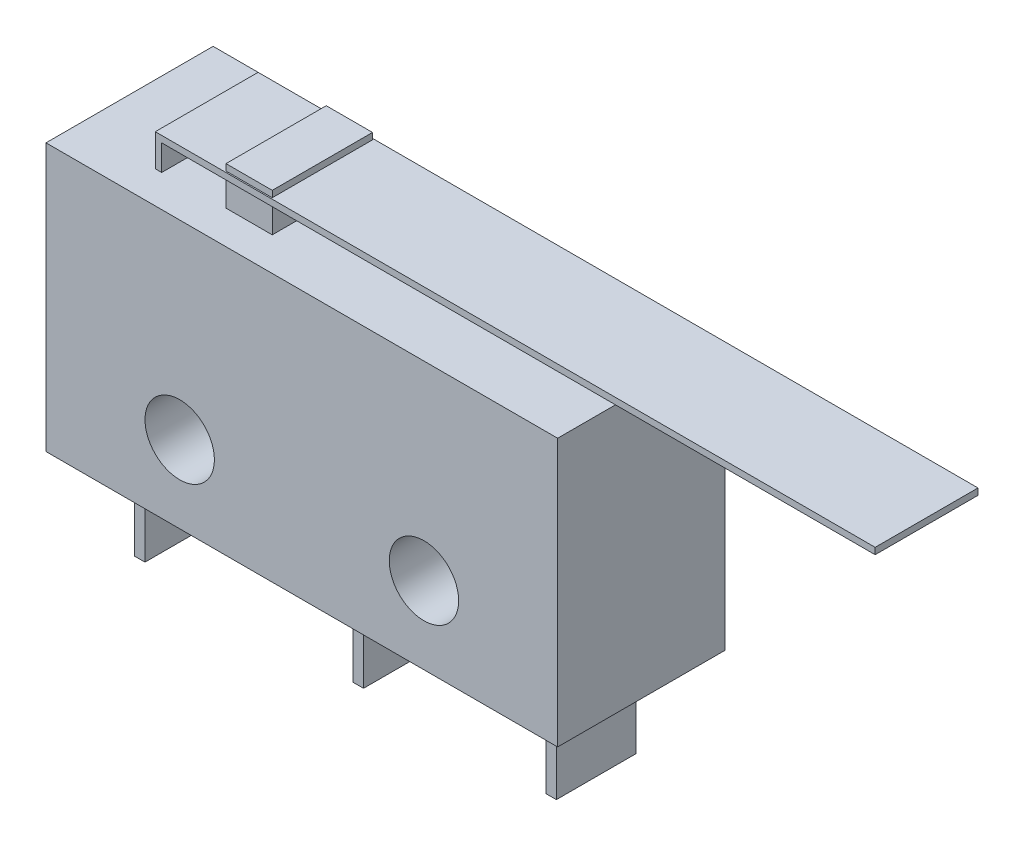
ISO-10303-21;
HEADER;
FILE_DESCRIPTION(('STEP AP214'),'2;1');
FILE_NAME('part.step','',(''),(''),'','','');
FILE_SCHEMA(('AUTOMOTIVE_DESIGN { 1 0 10303 214 1 1 1 1 }'));
ENDSEC;
DATA;
#1=APPLICATION_CONTEXT('core data for automotive mechanical design processes');
#2=APPLICATION_PROTOCOL_DEFINITION('international standard','automotive_design',2000,#1);
#3=PRODUCT_CONTEXT('',#1,'mechanical');
#4=PRODUCT('Part','Part','',(#3));
#5=PRODUCT_RELATED_PRODUCT_CATEGORY('part','',(#4));
#6=PRODUCT_DEFINITION_FORMATION('','',#4);
#7=PRODUCT_DEFINITION_CONTEXT('part definition',#1,'design');
#8=PRODUCT_DEFINITION('design','',#6,#7);
#9=PRODUCT_DEFINITION_SHAPE('','',#8);
#10=(LENGTH_UNIT() NAMED_UNIT(*) SI_UNIT(.MILLI.,.METRE.));
#11=(NAMED_UNIT(*) PLANE_ANGLE_UNIT() SI_UNIT($,.RADIAN.));
#12=(NAMED_UNIT(*) SI_UNIT($,.STERADIAN.) SOLID_ANGLE_UNIT());
#13=UNCERTAINTY_MEASURE_WITH_UNIT(LENGTH_MEASURE(1.E-05),#10,'distance_accuracy_value','');
#14=(GEOMETRIC_REPRESENTATION_CONTEXT(3) GLOBAL_UNCERTAINTY_ASSIGNED_CONTEXT((#13)) GLOBAL_UNIT_ASSIGNED_CONTEXT((#10,
#11,#12)) REPRESENTATION_CONTEXT('',''));
#15=CARTESIAN_POINT('',(0.,0.,0.));
#16=DIRECTION('',(0.,0.,1.));
#17=DIRECTION('',(1.,0.,0.));
#18=AXIS2_PLACEMENT_3D('',#15,#16,#17);
#19=CARTESIAN_POINT('',(-2.45,6.7,-1.95));
#20=DIRECTION('',(-1.,0.,0.));
#21=DIRECTION('',(0.,0.,1.));
#22=AXIS2_PLACEMENT_3D('',#19,#20,#21);
#23=PLANE('',#22);
#24=DIRECTION('',(0.,0.,-1.));
#25=VECTOR('',#24,1.);
#26=CARTESIAN_POINT('',(-2.45,6.2,-1.95));
#27=LINE('',#26,#25);
#28=CARTESIAN_POINT('',(-2.45,6.2,1.95));
#29=VERTEX_POINT('',#28);
#30=CARTESIAN_POINT('',(-2.45,6.2,-1.95));
#31=VERTEX_POINT('',#30);
#32=EDGE_CURVE('E295',#29,#31,#27,.T.);
#33=ORIENTED_EDGE('',*,*,#32,.F.);
#34=DIRECTION('',(0.,-1.,0.));
#35=VECTOR('',#34,1.);
#36=CARTESIAN_POINT('',(-2.45,6.7,1.95));
#37=LINE('',#36,#35);
#38=CARTESIAN_POINT('',(-2.45,5.2,1.95));
#39=VERTEX_POINT('',#38);
#40=EDGE_CURVE('E309',#29,#39,#37,.T.);
#41=ORIENTED_EDGE('',*,*,#40,.T.);
#42=DIRECTION('',(0.,0.,-1.));
#43=VECTOR('',#42,1.);
#44=CARTESIAN_POINT('',(-2.45,5.2,-1.95));
#45=LINE('',#44,#43);
#46=CARTESIAN_POINT('',(-2.45,5.2,-1.95));
#47=VERTEX_POINT('',#46);
#48=EDGE_CURVE('E298',#39,#47,#45,.T.);
#49=ORIENTED_EDGE('',*,*,#48,.T.);
#50=DIRECTION('',(0.,-1.,0.));
#51=VECTOR('',#50,1.);
#52=CARTESIAN_POINT('',(-2.45,6.7,-1.95));
#53=LINE('',#52,#51);
#54=EDGE_CURVE('E330',#31,#47,#53,.T.);
#55=ORIENTED_EDGE('',*,*,#54,.F.);
#56=EDGE_LOOP('',(#33,#41,#49,#55));
#57=FACE_BOUND('',#56,.T.);
#58=ADVANCED_FACE('F34',(#57),#23,.F.);
#59=CARTESIAN_POINT('',(-2.45,6.7,-1.95));
#60=DIRECTION('',(0.,0.,1.));
#61=DIRECTION('',(1.,0.,0.));
#62=AXIS2_PLACEMENT_3D('',#59,#60,#61);
#63=PLANE('',#62);
#64=DIRECTION('',(-1.,0.,0.));
#65=VECTOR('',#64,1.);
#66=CARTESIAN_POINT('',(-2.45,6.2,-1.95));
#67=LINE('',#66,#65);
#68=CARTESIAN_POINT('',(-4.25,6.2,-1.95));
#69=VERTEX_POINT('',#68);
#70=EDGE_CURVE('E292',#31,#69,#67,.T.);
#71=ORIENTED_EDGE('',*,*,#70,.F.);
#72=ORIENTED_EDGE('',*,*,#54,.T.);
#73=DIRECTION('',(-1.,0.,0.));
#74=VECTOR('',#73,1.);
#75=CARTESIAN_POINT('',(-2.45,5.2,-1.95));
#76=LINE('',#75,#74);
#77=CARTESIAN_POINT('',(-4.25,5.2,-1.95));
#78=VERTEX_POINT('',#77);
#79=EDGE_CURVE('E312',#47,#78,#76,.T.);
#80=ORIENTED_EDGE('',*,*,#79,.T.);
#81=DIRECTION('',(0.,-1.,0.));
#82=VECTOR('',#81,1.);
#83=CARTESIAN_POINT('',(-4.25,6.7,-1.95));
#84=LINE('',#83,#82);
#85=EDGE_CURVE('E326',#69,#78,#84,.T.);
#86=ORIENTED_EDGE('',*,*,#85,.F.);
#87=EDGE_LOOP('',(#71,#72,#80,#86));
#88=FACE_BOUND('',#87,.T.);
#89=ADVANCED_FACE('F497',(#88),#63,.F.);
#90=CARTESIAN_POINT('',(-4.25,6.7,-1.95));
#91=DIRECTION('',(1.,0.,0.));
#92=DIRECTION('',(0.,0.,-1.));
#93=AXIS2_PLACEMENT_3D('',#90,#91,#92);
#94=PLANE('',#93);
#95=DIRECTION('',(0.,0.,1.));
#96=VECTOR('',#95,1.);
#97=CARTESIAN_POINT('',(-4.25,6.2,-1.95));
#98=LINE('',#97,#96);
#99=CARTESIAN_POINT('',(-4.25,6.2,1.95));
#100=VERTEX_POINT('',#99);
#101=EDGE_CURVE('E289',#69,#100,#98,.T.);
#102=ORIENTED_EDGE('',*,*,#101,.F.);
#103=ORIENTED_EDGE('',*,*,#85,.T.);
#104=DIRECTION('',(0.,0.,1.));
#105=VECTOR('',#104,1.);
#106=CARTESIAN_POINT('',(-4.25,5.2,-1.95));
#107=LINE('',#106,#105);
#108=CARTESIAN_POINT('',(-4.25,5.2,1.95));
#109=VERTEX_POINT('',#108);
#110=EDGE_CURVE('E315',#78,#109,#107,.T.);
#111=ORIENTED_EDGE('',*,*,#110,.T.);
#112=DIRECTION('',(0.,-1.,0.));
#113=VECTOR('',#112,1.);
#114=CARTESIAN_POINT('',(-4.25,6.7,1.95));
#115=LINE('',#114,#113);
#116=EDGE_CURVE('E323',#100,#109,#115,.T.);
#117=ORIENTED_EDGE('',*,*,#116,.F.);
#118=EDGE_LOOP('',(#102,#103,#111,#117));
#119=FACE_BOUND('',#118,.T.);
#120=ADVANCED_FACE('F504',(#119),#94,.F.);
#121=CARTESIAN_POINT('',(-2.45,6.7,1.95));
#122=DIRECTION('',(0.,0.,-1.));
#123=DIRECTION('',(-1.,0.,0.));
#124=AXIS2_PLACEMENT_3D('',#121,#122,#123);
#125=PLANE('',#124);
#126=DIRECTION('',(1.,0.,0.));
#127=VECTOR('',#126,1.);
#128=CARTESIAN_POINT('',(-2.45,6.2,1.95));
#129=LINE('',#128,#127);
#130=EDGE_CURVE('E11',#100,#29,#129,.T.);
#131=ORIENTED_EDGE('',*,*,#130,.F.);
#132=ORIENTED_EDGE('',*,*,#116,.T.);
#133=DIRECTION('',(1.,0.,0.));
#134=VECTOR('',#133,1.);
#135=CARTESIAN_POINT('',(-2.45,5.2,1.95));
#136=LINE('',#135,#134);
#137=EDGE_CURVE('E303',#109,#39,#136,.T.);
#138=ORIENTED_EDGE('',*,*,#137,.T.);
#139=ORIENTED_EDGE('',*,*,#40,.F.);
#140=EDGE_LOOP('',(#131,#132,#138,#139));
#141=FACE_BOUND('',#140,.T.);
#142=ADVANCED_FACE('F594',(#141),#125,.F.);
#143=CARTESIAN_POINT('',(-9.95,5.2,3.25));
#144=DIRECTION('',(0.,-1.,0.));
#145=DIRECTION('',(0.,0.,-1.));
#146=AXIS2_PLACEMENT_3D('',#143,#144,#145);
#147=PLANE('',#146);
#148=DIRECTION('',(0.,0.,-1.));
#149=VECTOR('',#148,1.);
#150=CARTESIAN_POINT('',(-6.7,5.2,2.));
#151=LINE('',#150,#149);
#152=CARTESIAN_POINT('',(-6.7,5.2,2.));
#153=VERTEX_POINT('',#152);
#154=CARTESIAN_POINT('',(-6.7,5.2,-2.));
#155=VERTEX_POINT('',#154);
#156=EDGE_CURVE('E49',#153,#155,#151,.T.);
#157=ORIENTED_EDGE('',*,*,#156,.F.);
#158=DIRECTION('',(1.,0.,0.));
#159=VECTOR('',#158,1.);
#160=CARTESIAN_POINT('',(-6.95,5.2,2.));
#161=LINE('',#160,#159);
#162=CARTESIAN_POINT('',(-6.95,5.2,2.));
#163=VERTEX_POINT('',#162);
#164=EDGE_CURVE('E54',#163,#153,#161,.T.);
#165=ORIENTED_EDGE('',*,*,#164,.F.);
#166=DIRECTION('',(0.,0.,-1.));
#167=VECTOR('',#166,1.);
#168=CARTESIAN_POINT('',(-6.95,5.2,2.));
#169=LINE('',#168,#167);
#170=CARTESIAN_POINT('',(-6.95,5.2,-2.));
#171=VERTEX_POINT('',#170);
#172=EDGE_CURVE('E258',#163,#171,#169,.T.);
#173=ORIENTED_EDGE('',*,*,#172,.T.);
#174=DIRECTION('',(1.,0.,0.));
#175=VECTOR('',#174,1.);
#176=CARTESIAN_POINT('',(-6.95,5.2,-2.));
#177=LINE('',#176,#175);
#178=EDGE_CURVE('E259',#171,#155,#177,.T.);
#179=ORIENTED_EDGE('',*,*,#178,.T.);
#180=EDGE_LOOP('',(#157,#165,#173,#179));
#181=FACE_BOUND('',#180,.T.);
#182=DIRECTION('',(-1.,0.,0.));
#183=VECTOR('',#182,1.);
#184=CARTESIAN_POINT('',(-9.95,5.2,-3.25));
#185=LINE('',#184,#183);
#186=CARTESIAN_POINT('',(9.95,5.2,-3.25));
#187=VERTEX_POINT('',#186);
#188=CARTESIAN_POINT('',(-9.95,5.2,-3.25));
#189=VERTEX_POINT('',#188);
#190=EDGE_CURVE('E450',#187,#189,#185,.T.);
#191=ORIENTED_EDGE('',*,*,#190,.T.);
#192=DIRECTION('',(0.,0.,-1.));
#193=VECTOR('',#192,1.);
#194=CARTESIAN_POINT('',(-9.95,5.2,3.25));
#195=LINE('',#194,#193);
#196=CARTESIAN_POINT('',(-9.95,5.2,3.25));
#197=VERTEX_POINT('',#196);
#198=EDGE_CURVE('E456',#197,#189,#195,.T.);
#199=ORIENTED_EDGE('',*,*,#198,.F.);
#200=DIRECTION('',(-1.,0.,0.));
#201=VECTOR('',#200,1.);
#202=CARTESIAN_POINT('',(-9.95,5.2,3.25));
#203=LINE('',#202,#201);
#204=CARTESIAN_POINT('',(9.95,5.2,3.25));
#205=VERTEX_POINT('',#204);
#206=EDGE_CURVE('E454',#205,#197,#203,.T.);
#207=ORIENTED_EDGE('',*,*,#206,.F.);
#208=DIRECTION('',(0.,0.,-1.));
#209=VECTOR('',#208,1.);
#210=CARTESIAN_POINT('',(9.95,5.2,3.25));
#211=LINE('',#210,#209);
#212=EDGE_CURVE('E466',#205,#187,#211,.T.);
#213=ORIENTED_EDGE('',*,*,#212,.T.);
#214=EDGE_LOOP('',(#191,#199,#207,#213));
#215=FACE_BOUND('',#214,.T.);
#216=ORIENTED_EDGE('',*,*,#48,.F.);
#217=ORIENTED_EDGE('',*,*,#137,.F.);
#218=ORIENTED_EDGE('',*,*,#110,.F.);
#219=ORIENTED_EDGE('',*,*,#79,.F.);
#220=EDGE_LOOP('',(#216,#217,#218,#219));
#221=FACE_BOUND('',#220,.T.);
#222=ADVANCED_FACE('F590',(#181,#215,#221),#147,.F.);
#223=CARTESIAN_POINT('',(-9.95,-5.2,3.25));
#224=DIRECTION('',(0.,1.,0.));
#225=DIRECTION('',(-1.,0.,0.));
#226=AXIS2_PLACEMENT_3D('',#223,#224,#225);
#227=PLANE('',#226);
#228=DIRECTION('',(0.,0.,-1.));
#229=VECTOR('',#228,1.);
#230=CARTESIAN_POINT('',(-8.2,-5.2,1.55));
#231=LINE('',#230,#229);
#232=CARTESIAN_POINT('',(-8.2,-5.2,1.55));
#233=VERTEX_POINT('',#232);
#234=CARTESIAN_POINT('',(-8.2,-5.2,-1.55));
#235=VERTEX_POINT('',#234);
#236=EDGE_CURVE('E367',#233,#235,#231,.T.);
#237=ORIENTED_EDGE('',*,*,#236,.F.);
#238=DIRECTION('',(-1.,0.,0.));
#239=VECTOR('',#238,1.);
#240=CARTESIAN_POINT('',(-8.2,-5.2,1.55));
#241=LINE('',#240,#239);
#242=CARTESIAN_POINT('',(-7.8,-5.2,1.55));
#243=VERTEX_POINT('',#242);
#244=EDGE_CURVE('E372',#243,#233,#241,.T.);
#245=ORIENTED_EDGE('',*,*,#244,.F.);
#246=DIRECTION('',(0.,0.,1.));
#247=VECTOR('',#246,1.);
#248=CARTESIAN_POINT('',(-7.8,-5.2,1.55));
#249=LINE('',#248,#247);
#250=CARTESIAN_POINT('',(-7.8,-5.2,-1.55));
#251=VERTEX_POINT('',#250);
#252=EDGE_CURVE('E384',#251,#243,#249,.T.);
#253=ORIENTED_EDGE('',*,*,#252,.F.);
#254=DIRECTION('',(1.,0.,0.));
#255=VECTOR('',#254,1.);
#256=CARTESIAN_POINT('',(-8.2,-5.2,-1.55));
#257=LINE('',#256,#255);
#258=EDGE_CURVE('E381',#235,#251,#257,.T.);
#259=ORIENTED_EDGE('',*,*,#258,.F.);
#260=EDGE_LOOP('',(#237,#245,#253,#259));
#261=FACE_BOUND('',#260,.T.);
#262=DIRECTION('',(1.,0.,0.));
#263=VECTOR('',#262,1.);
#264=CARTESIAN_POINT('',(-9.95,-5.2,-3.25));
#265=LINE('',#264,#263);
#266=CARTESIAN_POINT('',(-9.95,-5.2,-3.25));
#267=VERTEX_POINT('',#266);
#268=CARTESIAN_POINT('',(9.95,-5.2,-3.25));
#269=VERTEX_POINT('',#268);
#270=EDGE_CURVE('E459',#267,#269,#265,.T.);
#271=ORIENTED_EDGE('',*,*,#270,.T.);
#272=DIRECTION('',(0.,0.,-1.));
#273=VECTOR('',#272,1.);
#274=CARTESIAN_POINT('',(9.95,-5.2,3.25));
#275=LINE('',#274,#273);
#276=CARTESIAN_POINT('',(9.95,-5.2,3.25));
#277=VERTEX_POINT('',#276);
#278=EDGE_CURVE('E469',#277,#269,#275,.T.);
#279=ORIENTED_EDGE('',*,*,#278,.F.);
#280=DIRECTION('',(1.,0.,0.));
#281=VECTOR('',#280,1.);
#282=CARTESIAN_POINT('',(-9.95,-5.2,3.25));
#283=LINE('',#282,#281);
#284=CARTESIAN_POINT('',(-9.95,-5.2,3.25));
#285=VERTEX_POINT('',#284);
#286=EDGE_CURVE('E449',#285,#277,#283,.T.);
#287=ORIENTED_EDGE('',*,*,#286,.F.);
#288=DIRECTION('',(0.,0.,-1.));
#289=VECTOR('',#288,1.);
#290=CARTESIAN_POINT('',(-9.95,-5.2,3.25));
#291=LINE('',#290,#289);
#292=EDGE_CURVE('E472',#285,#267,#291,.T.);
#293=ORIENTED_EDGE('',*,*,#292,.T.);
#294=EDGE_LOOP('',(#271,#279,#287,#293));
#295=FACE_BOUND('',#294,.T.);
#296=DIRECTION('',(0.,0.,-1.));
#297=VECTOR('',#296,1.);
#298=CARTESIAN_POINT('',(0.300000000000001,-5.2,1.55));
#299=LINE('',#298,#297);
#300=CARTESIAN_POINT('',(0.300000000000001,-5.2,1.55));
#301=VERTEX_POINT('',#300);
#302=CARTESIAN_POINT('',(0.3,-5.2,-1.55));
#303=VERTEX_POINT('',#302);
#304=EDGE_CURVE('E400',#301,#303,#299,.T.);
#305=ORIENTED_EDGE('',*,*,#304,.F.);
#306=DIRECTION('',(-1.,0.,0.));
#307=VECTOR('',#306,1.);
#308=CARTESIAN_POINT('',(0.300000000000001,-5.2,1.55));
#309=LINE('',#308,#307);
#310=CARTESIAN_POINT('',(0.700000000000001,-5.2,1.55));
#311=VERTEX_POINT('',#310);
#312=EDGE_CURVE('E405',#311,#301,#309,.T.);
#313=ORIENTED_EDGE('',*,*,#312,.F.);
#314=DIRECTION('',(0.,0.,1.));
#315=VECTOR('',#314,1.);
#316=CARTESIAN_POINT('',(0.700000000000001,-5.2,1.55));
#317=LINE('',#316,#315);
#318=CARTESIAN_POINT('',(0.700000000000001,-5.2,-1.55));
#319=VERTEX_POINT('',#318);
#320=EDGE_CURVE('E417',#319,#311,#317,.T.);
#321=ORIENTED_EDGE('',*,*,#320,.F.);
#322=DIRECTION('',(1.,0.,0.));
#323=VECTOR('',#322,1.);
#324=CARTESIAN_POINT('',(0.300000000000001,-5.2,-1.55));
#325=LINE('',#324,#323);
#326=EDGE_CURVE('E414',#303,#319,#325,.T.);
#327=ORIENTED_EDGE('',*,*,#326,.F.);
#328=EDGE_LOOP('',(#305,#313,#321,#327));
#329=FACE_BOUND('',#328,.T.);
#330=DIRECTION('',(0.,0.,1.));
#331=VECTOR('',#330,1.);
#332=CARTESIAN_POINT('',(8.2,-5.2,1.55));
#333=LINE('',#332,#331);
#334=CARTESIAN_POINT('',(8.2,-5.2,-1.55));
#335=VERTEX_POINT('',#334);
#336=CARTESIAN_POINT('',(8.2,-5.2,1.55));
#337=VERTEX_POINT('',#336);
#338=EDGE_CURVE('E334',#335,#337,#333,.T.);
#339=ORIENTED_EDGE('',*,*,#338,.F.);
#340=DIRECTION('',(1.,0.,0.));
#341=VECTOR('',#340,1.);
#342=CARTESIAN_POINT('',(8.2,-5.2,-1.55));
#343=LINE('',#342,#341);
#344=CARTESIAN_POINT('',(7.8,-5.2,-1.55));
#345=VERTEX_POINT('',#344);
#346=EDGE_CURVE('E339',#345,#335,#343,.T.);
#347=ORIENTED_EDGE('',*,*,#346,.F.);
#348=DIRECTION('',(0.,0.,-1.));
#349=VECTOR('',#348,1.);
#350=CARTESIAN_POINT('',(7.8,-5.2,1.55));
#351=LINE('',#350,#349);
#352=CARTESIAN_POINT('',(7.8,-5.2,1.55));
#353=VERTEX_POINT('',#352);
#354=EDGE_CURVE('E351',#353,#345,#351,.T.);
#355=ORIENTED_EDGE('',*,*,#354,.F.);
#356=DIRECTION('',(-1.,0.,0.));
#357=VECTOR('',#356,1.);
#358=CARTESIAN_POINT('',(8.2,-5.2,1.55));
#359=LINE('',#358,#357);
#360=EDGE_CURVE('E348',#337,#353,#359,.T.);
#361=ORIENTED_EDGE('',*,*,#360,.F.);
#362=EDGE_LOOP('',(#339,#347,#355,#361));
#363=FACE_BOUND('',#362,.T.);
#364=ADVANCED_FACE('F593',(#261,#295,#329,#363),#227,.F.);
#365=CARTESIAN_POINT('',(-9.95,5.2,3.25));
#366=DIRECTION('',(1.,0.,0.));
#367=DIRECTION('',(0.,0.,-1.));
#368=AXIS2_PLACEMENT_3D('',#365,#366,#367);
#369=PLANE('',#368);
#370=DIRECTION('',(0.,-1.,0.));
#371=VECTOR('',#370,1.);
#372=CARTESIAN_POINT('',(-9.95,5.2,-3.25));
#373=LINE('',#372,#371);
#374=EDGE_CURVE('E445',#189,#267,#373,.T.);
#375=ORIENTED_EDGE('',*,*,#374,.T.);
#376=ORIENTED_EDGE('',*,*,#292,.F.);
#377=DIRECTION('',(0.,-1.,0.));
#378=VECTOR('',#377,1.);
#379=CARTESIAN_POINT('',(-9.95,5.2,3.25));
#380=LINE('',#379,#378);
#381=EDGE_CURVE('E446',#197,#285,#380,.T.);
#382=ORIENTED_EDGE('',*,*,#381,.F.);
#383=ORIENTED_EDGE('',*,*,#198,.T.);
#384=EDGE_LOOP('',(#375,#376,#382,#383));
#385=FACE_BOUND('',#384,.T.);
#386=ADVANCED_FACE('F36',(#385),#369,.F.);
#387=CARTESIAN_POINT('',(9.95,5.2,3.25));
#388=DIRECTION('',(-1.,0.,0.));
#389=DIRECTION('',(0.,0.,1.));
#390=AXIS2_PLACEMENT_3D('',#387,#388,#389);
#391=PLANE('',#390);
#392=DIRECTION('',(0.,1.,0.));
#393=VECTOR('',#392,1.);
#394=CARTESIAN_POINT('',(9.95,5.2,-3.25));
#395=LINE('',#394,#393);
#396=EDGE_CURVE('E461',#269,#187,#395,.T.);
#397=ORIENTED_EDGE('',*,*,#396,.T.);
#398=ORIENTED_EDGE('',*,*,#212,.F.);
#399=DIRECTION('',(0.,1.,0.));
#400=VECTOR('',#399,1.);
#401=CARTESIAN_POINT('',(9.95,5.2,3.25));
#402=LINE('',#401,#400);
#403=EDGE_CURVE('E452',#277,#205,#402,.T.);
#404=ORIENTED_EDGE('',*,*,#403,.F.);
#405=ORIENTED_EDGE('',*,*,#278,.T.);
#406=EDGE_LOOP('',(#397,#398,#404,#405));
#407=FACE_BOUND('',#406,.T.);
#408=ADVANCED_FACE('F585',(#407),#391,.F.);
#409=CARTESIAN_POINT('',(0.,0.,3.25));
#410=DIRECTION('',(0.,0.,1.));
#411=DIRECTION('',(1.,0.,0.));
#412=AXIS2_PLACEMENT_3D('',#409,#410,#411);
#413=PLANE('',#412);
#414=CARTESIAN_POINT('',(-4.75,-2.2,3.25));
#415=DIRECTION('',(0.,0.,1.));
#416=DIRECTION('',(1.,0.,0.));
#417=AXIS2_PLACEMENT_3D('',#414,#415,#416);
#418=CIRCLE('',#417,1.35);
#419=CARTESIAN_POINT('',(-3.4,-2.2,3.25));
#420=VERTEX_POINT('',#419);
#421=EDGE_CURVE('E433',#420,#420,#418,.T.);
#422=ORIENTED_EDGE('',*,*,#421,.F.);
#423=EDGE_LOOP('',(#422));
#424=FACE_BOUND('',#423,.T.);
#425=CARTESIAN_POINT('',(4.75,-2.2,3.25));
#426=DIRECTION('',(0.,0.,1.));
#427=DIRECTION('',(1.,0.,0.));
#428=AXIS2_PLACEMENT_3D('',#425,#426,#427);
#429=CIRCLE('',#428,1.35);
#430=CARTESIAN_POINT('',(6.1,-2.2,3.25));
#431=VERTEX_POINT('',#430);
#432=EDGE_CURVE('E439',#431,#431,#429,.T.);
#433=ORIENTED_EDGE('',*,*,#432,.F.);
#434=EDGE_LOOP('',(#433));
#435=FACE_BOUND('',#434,.T.);
#436=ORIENTED_EDGE('',*,*,#381,.T.);
#437=ORIENTED_EDGE('',*,*,#286,.T.);
#438=ORIENTED_EDGE('',*,*,#403,.T.);
#439=ORIENTED_EDGE('',*,*,#206,.T.);
#440=EDGE_LOOP('',(#436,#437,#438,#439));
#441=FACE_BOUND('',#440,.T.);
#442=ADVANCED_FACE('F582',(#424,#435,#441),#413,.T.);
#443=CARTESIAN_POINT('',(0.,0.,-3.25));
#444=DIRECTION('',(0.,0.,1.));
#445=DIRECTION('',(1.,0.,0.));
#446=AXIS2_PLACEMENT_3D('',#443,#444,#445);
#447=PLANE('',#446);
#448=CARTESIAN_POINT('',(-4.75,-2.2,-3.25));
#449=DIRECTION('',(0.,0.,1.));
#450=DIRECTION('',(1.,0.,0.));
#451=AXIS2_PLACEMENT_3D('',#448,#449,#450);
#452=CIRCLE('',#451,1.35);
#453=CARTESIAN_POINT('',(-3.4,-2.2,-3.25));
#454=VERTEX_POINT('',#453);
#455=EDGE_CURVE('E436',#454,#454,#452,.T.);
#456=ORIENTED_EDGE('',*,*,#455,.T.);
#457=EDGE_LOOP('',(#456));
#458=FACE_BOUND('',#457,.T.);
#459=CARTESIAN_POINT('',(4.75,-2.2,-3.25));
#460=DIRECTION('',(0.,0.,1.));
#461=DIRECTION('',(1.,0.,0.));
#462=AXIS2_PLACEMENT_3D('',#459,#460,#461);
#463=CIRCLE('',#462,1.35);
#464=CARTESIAN_POINT('',(6.1,-2.2,-3.25));
#465=VERTEX_POINT('',#464);
#466=EDGE_CURVE('E442',#465,#465,#463,.T.);
#467=ORIENTED_EDGE('',*,*,#466,.T.);
#468=EDGE_LOOP('',(#467));
#469=FACE_BOUND('',#468,.T.);
#470=ORIENTED_EDGE('',*,*,#374,.F.);
#471=ORIENTED_EDGE('',*,*,#190,.F.);
#472=ORIENTED_EDGE('',*,*,#396,.F.);
#473=ORIENTED_EDGE('',*,*,#270,.F.);
#474=EDGE_LOOP('',(#470,#471,#472,#473));
#475=FACE_BOUND('',#474,.T.);
#476=ADVANCED_FACE('F580',(#458,#469,#475),#447,.F.);
#477=CARTESIAN_POINT('',(4.75,-2.2,3.25));
#478=DIRECTION('',(0.,0.,1.));
#479=DIRECTION('',(1.,0.,0.));
#480=AXIS2_PLACEMENT_3D('',#477,#478,#479);
#481=CYLINDRICAL_SURFACE('',#480,1.35);
#482=ORIENTED_EDGE('',*,*,#466,.F.);
#483=EDGE_LOOP('',(#482));
#484=FACE_BOUND('',#483,.T.);
#485=ORIENTED_EDGE('',*,*,#432,.T.);
#486=EDGE_LOOP('',(#485));
#487=FACE_BOUND('',#486,.T.);
#488=ADVANCED_FACE('F576',(#484,#487),#481,.F.);
#489=CARTESIAN_POINT('',(-4.75,-2.2,3.25));
#490=DIRECTION('',(0.,0.,1.));
#491=DIRECTION('',(1.,0.,0.));
#492=AXIS2_PLACEMENT_3D('',#489,#490,#491);
#493=CYLINDRICAL_SURFACE('',#492,1.35);
#494=ORIENTED_EDGE('',*,*,#455,.F.);
#495=EDGE_LOOP('',(#494));
#496=FACE_BOUND('',#495,.T.);
#497=ORIENTED_EDGE('',*,*,#421,.T.);
#498=EDGE_LOOP('',(#497));
#499=FACE_BOUND('',#498,.T.);
#500=ADVANCED_FACE('F572',(#496,#499),#493,.F.);
#501=CARTESIAN_POINT('',(0.300000000000001,-8.7,1.55));
#502=DIRECTION('',(1.,0.,0.));
#503=DIRECTION('',(0.,1.,0.));
#504=AXIS2_PLACEMENT_3D('',#501,#502,#503);
#505=PLANE('',#504);
#506=ORIENTED_EDGE('',*,*,#304,.T.);
#507=DIRECTION('',(0.,1.,0.));
#508=VECTOR('',#507,1.);
#509=CARTESIAN_POINT('',(0.300000000000001,-8.7,-1.55));
#510=LINE('',#509,#508);
#511=CARTESIAN_POINT('',(0.300000000000001,-8.7,-1.55));
#512=VERTEX_POINT('',#511);
#513=EDGE_CURVE('E430',#512,#303,#510,.T.);
#514=ORIENTED_EDGE('',*,*,#513,.F.);
#515=DIRECTION('',(0.,0.,-1.));
#516=VECTOR('',#515,1.);
#517=CARTESIAN_POINT('',(0.300000000000001,-8.7,1.55));
#518=LINE('',#517,#516);
#519=CARTESIAN_POINT('',(0.300000000000001,-8.7,1.55));
#520=VERTEX_POINT('',#519);
#521=EDGE_CURVE('E401',#520,#512,#518,.T.);
#522=ORIENTED_EDGE('',*,*,#521,.F.);
#523=DIRECTION('',(0.,1.,0.));
#524=VECTOR('',#523,1.);
#525=CARTESIAN_POINT('',(0.300000000000001,-8.7,1.55));
#526=LINE('',#525,#524);
#527=EDGE_CURVE('E411',#520,#301,#526,.T.);
#528=ORIENTED_EDGE('',*,*,#527,.T.);
#529=EDGE_LOOP('',(#506,#514,#522,#528));
#530=FACE_BOUND('',#529,.T.);
#531=ADVANCED_FACE('F568',(#530),#505,.F.);
#532=CARTESIAN_POINT('',(0.300000000000001,-8.7,-1.55));
#533=DIRECTION('',(0.,0.,1.));
#534=DIRECTION('',(1.,0.,0.));
#535=AXIS2_PLACEMENT_3D('',#532,#533,#534);
#536=PLANE('',#535);
#537=ORIENTED_EDGE('',*,*,#326,.T.);
#538=DIRECTION('',(0.,1.,0.));
#539=VECTOR('',#538,1.);
#540=CARTESIAN_POINT('',(0.700000000000001,-8.7,-1.55));
#541=LINE('',#540,#539);
#542=CARTESIAN_POINT('',(0.700000000000001,-8.7,-1.55));
#543=VERTEX_POINT('',#542);
#544=EDGE_CURVE('E427',#543,#319,#541,.T.);
#545=ORIENTED_EDGE('',*,*,#544,.F.);
#546=DIRECTION('',(1.,0.,0.));
#547=VECTOR('',#546,1.);
#548=CARTESIAN_POINT('',(0.300000000000001,-8.7,-1.55));
#549=LINE('',#548,#547);
#550=EDGE_CURVE('E404',#512,#543,#549,.T.);
#551=ORIENTED_EDGE('',*,*,#550,.F.);
#552=ORIENTED_EDGE('',*,*,#513,.T.);
#553=EDGE_LOOP('',(#537,#545,#551,#552));
#554=FACE_BOUND('',#553,.T.);
#555=ADVANCED_FACE('F564',(#554),#536,.F.);
#556=CARTESIAN_POINT('',(0.700000000000001,-8.7,1.55));
#557=DIRECTION('',(-1.,0.,0.));
#558=DIRECTION('',(0.,-1.,0.));
#559=AXIS2_PLACEMENT_3D('',#556,#557,#558);
#560=PLANE('',#559);
#561=ORIENTED_EDGE('',*,*,#320,.T.);
#562=DIRECTION('',(0.,1.,0.));
#563=VECTOR('',#562,1.);
#564=CARTESIAN_POINT('',(0.700000000000001,-8.7,1.55));
#565=LINE('',#564,#563);
#566=CARTESIAN_POINT('',(0.700000000000001,-8.7,1.55));
#567=VERTEX_POINT('',#566);
#568=EDGE_CURVE('E424',#567,#311,#565,.T.);
#569=ORIENTED_EDGE('',*,*,#568,.F.);
#570=DIRECTION('',(0.,0.,1.));
#571=VECTOR('',#570,1.);
#572=CARTESIAN_POINT('',(0.700000000000001,-8.7,1.55));
#573=LINE('',#572,#571);
#574=EDGE_CURVE('E407',#543,#567,#573,.T.);
#575=ORIENTED_EDGE('',*,*,#574,.F.);
#576=ORIENTED_EDGE('',*,*,#544,.T.);
#577=EDGE_LOOP('',(#561,#569,#575,#576));
#578=FACE_BOUND('',#577,.T.);
#579=ADVANCED_FACE('F560',(#578),#560,.F.);
#580=CARTESIAN_POINT('',(0.300000000000001,-8.7,1.55));
#581=DIRECTION('',(0.,0.,-1.));
#582=DIRECTION('',(-1.,0.,0.));
#583=AXIS2_PLACEMENT_3D('',#580,#581,#582);
#584=PLANE('',#583);
#585=ORIENTED_EDGE('',*,*,#312,.T.);
#586=ORIENTED_EDGE('',*,*,#527,.F.);
#587=DIRECTION('',(-1.,0.,0.));
#588=VECTOR('',#587,1.);
#589=CARTESIAN_POINT('',(0.300000000000001,-8.7,1.55));
#590=LINE('',#589,#588);
#591=EDGE_CURVE('E409',#567,#520,#590,.T.);
#592=ORIENTED_EDGE('',*,*,#591,.F.);
#593=ORIENTED_EDGE('',*,*,#568,.T.);
#594=EDGE_LOOP('',(#585,#586,#592,#593));
#595=FACE_BOUND('',#594,.T.);
#596=ADVANCED_FACE('F556',(#595),#584,.F.);
#597=CARTESIAN_POINT('',(0.,-8.7,0.));
#598=DIRECTION('',(0.,-1.,0.));
#599=DIRECTION('',(0.,0.,-1.));
#600=AXIS2_PLACEMENT_3D('',#597,#598,#599);
#601=PLANE('',#600);
#602=ORIENTED_EDGE('',*,*,#521,.T.);
#603=ORIENTED_EDGE('',*,*,#550,.T.);
#604=ORIENTED_EDGE('',*,*,#574,.T.);
#605=ORIENTED_EDGE('',*,*,#591,.T.);
#606=EDGE_LOOP('',(#602,#603,#604,#605));
#607=FACE_BOUND('',#606,.T.);
#608=ADVANCED_FACE('F552',(#607),#601,.T.);
#609=CARTESIAN_POINT('',(-8.2,-8.7,1.55));
#610=DIRECTION('',(1.,0.,0.));
#611=DIRECTION('',(0.,1.,0.));
#612=AXIS2_PLACEMENT_3D('',#609,#610,#611);
#613=PLANE('',#612);
#614=ORIENTED_EDGE('',*,*,#236,.T.);
#615=DIRECTION('',(0.,1.,0.));
#616=VECTOR('',#615,1.);
#617=CARTESIAN_POINT('',(-8.2,-8.7,-1.55));
#618=LINE('',#617,#616);
#619=CARTESIAN_POINT('',(-8.2,-8.7,-1.55));
#620=VERTEX_POINT('',#619);
#621=EDGE_CURVE('E397',#620,#235,#618,.T.);
#622=ORIENTED_EDGE('',*,*,#621,.F.);
#623=DIRECTION('',(0.,0.,-1.));
#624=VECTOR('',#623,1.);
#625=CARTESIAN_POINT('',(-8.2,-8.7,1.55));
#626=LINE('',#625,#624);
#627=CARTESIAN_POINT('',(-8.2,-8.7,1.55));
#628=VERTEX_POINT('',#627);
#629=EDGE_CURVE('E368',#628,#620,#626,.T.);
#630=ORIENTED_EDGE('',*,*,#629,.F.);
#631=DIRECTION('',(0.,1.,0.));
#632=VECTOR('',#631,1.);
#633=CARTESIAN_POINT('',(-8.2,-8.7,1.55));
#634=LINE('',#633,#632);
#635=EDGE_CURVE('E378',#628,#233,#634,.T.);
#636=ORIENTED_EDGE('',*,*,#635,.T.);
#637=EDGE_LOOP('',(#614,#622,#630,#636));
#638=FACE_BOUND('',#637,.T.);
#639=ADVANCED_FACE('F548',(#638),#613,.F.);
#640=CARTESIAN_POINT('',(-8.2,-8.7,-1.55));
#641=DIRECTION('',(0.,0.,1.));
#642=DIRECTION('',(1.,0.,0.));
#643=AXIS2_PLACEMENT_3D('',#640,#641,#642);
#644=PLANE('',#643);
#645=ORIENTED_EDGE('',*,*,#258,.T.);
#646=DIRECTION('',(0.,1.,0.));
#647=VECTOR('',#646,1.);
#648=CARTESIAN_POINT('',(-7.8,-8.7,-1.55));
#649=LINE('',#648,#647);
#650=CARTESIAN_POINT('',(-7.8,-8.7,-1.55));
#651=VERTEX_POINT('',#650);
#652=EDGE_CURVE('E394',#651,#251,#649,.T.);
#653=ORIENTED_EDGE('',*,*,#652,.F.);
#654=DIRECTION('',(1.,0.,0.));
#655=VECTOR('',#654,1.);
#656=CARTESIAN_POINT('',(-8.2,-8.7,-1.55));
#657=LINE('',#656,#655);
#658=EDGE_CURVE('E371',#620,#651,#657,.T.);
#659=ORIENTED_EDGE('',*,*,#658,.F.);
#660=ORIENTED_EDGE('',*,*,#621,.T.);
#661=EDGE_LOOP('',(#645,#653,#659,#660));
#662=FACE_BOUND('',#661,.T.);
#663=ADVANCED_FACE('F544',(#662),#644,.F.);
#664=CARTESIAN_POINT('',(-7.8,-8.7,1.55));
#665=DIRECTION('',(-1.,0.,0.));
#666=DIRECTION('',(0.,-1.,0.));
#667=AXIS2_PLACEMENT_3D('',#664,#665,#666);
#668=PLANE('',#667);
#669=ORIENTED_EDGE('',*,*,#252,.T.);
#670=DIRECTION('',(0.,1.,0.));
#671=VECTOR('',#670,1.);
#672=CARTESIAN_POINT('',(-7.8,-8.7,1.55));
#673=LINE('',#672,#671);
#674=CARTESIAN_POINT('',(-7.8,-8.7,1.55));
#675=VERTEX_POINT('',#674);
#676=EDGE_CURVE('E391',#675,#243,#673,.T.);
#677=ORIENTED_EDGE('',*,*,#676,.F.);
#678=DIRECTION('',(0.,0.,1.));
#679=VECTOR('',#678,1.);
#680=CARTESIAN_POINT('',(-7.8,-8.7,1.55));
#681=LINE('',#680,#679);
#682=EDGE_CURVE('E374',#651,#675,#681,.T.);
#683=ORIENTED_EDGE('',*,*,#682,.F.);
#684=ORIENTED_EDGE('',*,*,#652,.T.);
#685=EDGE_LOOP('',(#669,#677,#683,#684));
#686=FACE_BOUND('',#685,.T.);
#687=ADVANCED_FACE('F540',(#686),#668,.F.);
#688=CARTESIAN_POINT('',(-8.2,-8.7,1.55));
#689=DIRECTION('',(0.,0.,-1.));
#690=DIRECTION('',(-1.,0.,0.));
#691=AXIS2_PLACEMENT_3D('',#688,#689,#690);
#692=PLANE('',#691);
#693=ORIENTED_EDGE('',*,*,#244,.T.);
#694=ORIENTED_EDGE('',*,*,#635,.F.);
#695=DIRECTION('',(-1.,0.,0.));
#696=VECTOR('',#695,1.);
#697=CARTESIAN_POINT('',(-8.2,-8.7,1.55));
#698=LINE('',#697,#696);
#699=EDGE_CURVE('E376',#675,#628,#698,.T.);
#700=ORIENTED_EDGE('',*,*,#699,.F.);
#701=ORIENTED_EDGE('',*,*,#676,.T.);
#702=EDGE_LOOP('',(#693,#694,#700,#701));
#703=FACE_BOUND('',#702,.T.);
#704=ADVANCED_FACE('F536',(#703),#692,.F.);
#705=CARTESIAN_POINT('',(0.,-8.7,0.));
#706=DIRECTION('',(0.,-1.,0.));
#707=DIRECTION('',(0.,0.,-1.));
#708=AXIS2_PLACEMENT_3D('',#705,#706,#707);
#709=PLANE('',#708);
#710=ORIENTED_EDGE('',*,*,#629,.T.);
#711=ORIENTED_EDGE('',*,*,#658,.T.);
#712=ORIENTED_EDGE('',*,*,#682,.T.);
#713=ORIENTED_EDGE('',*,*,#699,.T.);
#714=EDGE_LOOP('',(#710,#711,#712,#713));
#715=FACE_BOUND('',#714,.T.);
#716=ADVANCED_FACE('F532',(#715),#709,.T.);
#717=CARTESIAN_POINT('',(8.2,-8.7,1.55));
#718=DIRECTION('',(-1.,0.,0.));
#719=DIRECTION('',(0.,-1.,0.));
#720=AXIS2_PLACEMENT_3D('',#717,#718,#719);
#721=PLANE('',#720);
#722=ORIENTED_EDGE('',*,*,#338,.T.);
#723=DIRECTION('',(0.,1.,0.));
#724=VECTOR('',#723,1.);
#725=CARTESIAN_POINT('',(8.2,-8.7,1.55));
#726=LINE('',#725,#724);
#727=CARTESIAN_POINT('',(8.2,-8.7,1.55));
#728=VERTEX_POINT('',#727);
#729=EDGE_CURVE('E364',#728,#337,#726,.T.);
#730=ORIENTED_EDGE('',*,*,#729,.F.);
#731=DIRECTION('',(0.,0.,1.));
#732=VECTOR('',#731,1.);
#733=CARTESIAN_POINT('',(8.2,-8.7,1.55));
#734=LINE('',#733,#732);
#735=CARTESIAN_POINT('',(8.2,-8.7,-1.55));
#736=VERTEX_POINT('',#735);
#737=EDGE_CURVE('E335',#736,#728,#734,.T.);
#738=ORIENTED_EDGE('',*,*,#737,.F.);
#739=DIRECTION('',(0.,1.,0.));
#740=VECTOR('',#739,1.);
#741=CARTESIAN_POINT('',(8.2,-8.7,-1.55));
#742=LINE('',#741,#740);
#743=EDGE_CURVE('E345',#736,#335,#742,.T.);
#744=ORIENTED_EDGE('',*,*,#743,.T.);
#745=EDGE_LOOP('',(#722,#730,#738,#744));
#746=FACE_BOUND('',#745,.T.);
#747=ADVANCED_FACE('F528',(#746),#721,.F.);
#748=CARTESIAN_POINT('',(8.2,-8.7,1.55));
#749=DIRECTION('',(0.,0.,-1.));
#750=DIRECTION('',(-1.,0.,0.));
#751=AXIS2_PLACEMENT_3D('',#748,#749,#750);
#752=PLANE('',#751);
#753=ORIENTED_EDGE('',*,*,#360,.T.);
#754=DIRECTION('',(0.,1.,0.));
#755=VECTOR('',#754,1.);
#756=CARTESIAN_POINT('',(7.8,-8.7,1.55));
#757=LINE('',#756,#755);
#758=CARTESIAN_POINT('',(7.8,-8.7,1.55));
#759=VERTEX_POINT('',#758);
#760=EDGE_CURVE('E361',#759,#353,#757,.T.);
#761=ORIENTED_EDGE('',*,*,#760,.F.);
#762=DIRECTION('',(-1.,0.,0.));
#763=VECTOR('',#762,1.);
#764=CARTESIAN_POINT('',(8.2,-8.7,1.55));
#765=LINE('',#764,#763);
#766=EDGE_CURVE('E338',#728,#759,#765,.T.);
#767=ORIENTED_EDGE('',*,*,#766,.F.);
#768=ORIENTED_EDGE('',*,*,#729,.T.);
#769=EDGE_LOOP('',(#753,#761,#767,#768));
#770=FACE_BOUND('',#769,.T.);
#771=ADVANCED_FACE('F524',(#770),#752,.F.);
#772=CARTESIAN_POINT('',(7.8,-8.7,1.55));
#773=DIRECTION('',(1.,0.,0.));
#774=DIRECTION('',(0.,1.,0.));
#775=AXIS2_PLACEMENT_3D('',#772,#773,#774);
#776=PLANE('',#775);
#777=ORIENTED_EDGE('',*,*,#354,.T.);
#778=DIRECTION('',(0.,1.,0.));
#779=VECTOR('',#778,1.);
#780=CARTESIAN_POINT('',(7.8,-8.7,-1.55));
#781=LINE('',#780,#779);
#782=CARTESIAN_POINT('',(7.8,-8.7,-1.55));
#783=VERTEX_POINT('',#782);
#784=EDGE_CURVE('E358',#783,#345,#781,.T.);
#785=ORIENTED_EDGE('',*,*,#784,.F.);
#786=DIRECTION('',(0.,0.,-1.));
#787=VECTOR('',#786,1.);
#788=CARTESIAN_POINT('',(7.8,-8.7,1.55));
#789=LINE('',#788,#787);
#790=EDGE_CURVE('E341',#759,#783,#789,.T.);
#791=ORIENTED_EDGE('',*,*,#790,.F.);
#792=ORIENTED_EDGE('',*,*,#760,.T.);
#793=EDGE_LOOP('',(#777,#785,#791,#792));
#794=FACE_BOUND('',#793,.T.);
#795=ADVANCED_FACE('F520',(#794),#776,.F.);
#796=CARTESIAN_POINT('',(8.2,-8.7,-1.55));
#797=DIRECTION('',(0.,0.,1.));
#798=DIRECTION('',(1.,0.,0.));
#799=AXIS2_PLACEMENT_3D('',#796,#797,#798);
#800=PLANE('',#799);
#801=ORIENTED_EDGE('',*,*,#346,.T.);
#802=ORIENTED_EDGE('',*,*,#743,.F.);
#803=DIRECTION('',(1.,0.,0.));
#804=VECTOR('',#803,1.);
#805=CARTESIAN_POINT('',(8.2,-8.7,-1.55));
#806=LINE('',#805,#804);
#807=EDGE_CURVE('E343',#783,#736,#806,.T.);
#808=ORIENTED_EDGE('',*,*,#807,.F.);
#809=ORIENTED_EDGE('',*,*,#784,.T.);
#810=EDGE_LOOP('',(#801,#802,#808,#809));
#811=FACE_BOUND('',#810,.T.);
#812=ADVANCED_FACE('F516',(#811),#800,.F.);
#813=CARTESIAN_POINT('',(0.,-8.7,0.));
#814=DIRECTION('',(0.,1.,0.));
#815=DIRECTION('',(0.,0.,1.));
#816=AXIS2_PLACEMENT_3D('',#813,#814,#815);
#817=PLANE('',#816);
#818=ORIENTED_EDGE('',*,*,#737,.T.);
#819=ORIENTED_EDGE('',*,*,#766,.T.);
#820=ORIENTED_EDGE('',*,*,#790,.T.);
#821=ORIENTED_EDGE('',*,*,#807,.T.);
#822=EDGE_LOOP('',(#818,#819,#820,#821));
#823=FACE_BOUND('',#822,.T.);
#824=ADVANCED_FACE('F513',(#823),#817,.F.);
#825=CARTESIAN_POINT('',(-6.7,6.2,2.));
#826=DIRECTION('',(0.,1.,0.));
#827=DIRECTION('',(0.,0.,1.));
#828=AXIS2_PLACEMENT_3D('',#825,#826,#827);
#829=PLANE('',#828);
#830=DIRECTION('',(1.,0.,0.));
#831=VECTOR('',#830,1.);
#832=CARTESIAN_POINT('',(-6.7,6.2,-2.));
#833=LINE('',#832,#831);
#834=CARTESIAN_POINT('',(-6.7,6.2,-2.));
#835=VERTEX_POINT('',#834);
#836=CARTESIAN_POINT('',(21.05,6.2,-2.));
#837=VERTEX_POINT('',#836);
#838=EDGE_CURVE('E262',#835,#837,#833,.T.);
#839=ORIENTED_EDGE('',*,*,#838,.T.);
#840=DIRECTION('',(0.,0.,-1.));
#841=VECTOR('',#840,1.);
#842=CARTESIAN_POINT('',(21.05,6.2,2.));
#843=LINE('',#842,#841);
#844=CARTESIAN_POINT('',(21.05,6.2,2.));
#845=VERTEX_POINT('',#844);
#846=EDGE_CURVE('E243',#845,#837,#843,.T.);
#847=ORIENTED_EDGE('',*,*,#846,.F.);
#848=DIRECTION('',(1.,0.,0.));
#849=VECTOR('',#848,1.);
#850=CARTESIAN_POINT('',(-6.7,6.2,2.));
#851=LINE('',#850,#849);
#852=CARTESIAN_POINT('',(-6.7,6.2,2.));
#853=VERTEX_POINT('',#852);
#854=EDGE_CURVE('E232',#853,#845,#851,.T.);
#855=ORIENTED_EDGE('',*,*,#854,.F.);
#856=DIRECTION('',(0.,0.,-1.));
#857=VECTOR('',#856,1.);
#858=CARTESIAN_POINT('',(-6.7,6.2,2.));
#859=LINE('',#858,#857);
#860=EDGE_CURVE('E237',#853,#835,#859,.T.);
#861=ORIENTED_EDGE('',*,*,#860,.T.);
#862=EDGE_LOOP('',(#839,#847,#855,#861));
#863=FACE_BOUND('',#862,.T.);
#864=ORIENTED_EDGE('',*,*,#130,.T.);
#865=ORIENTED_EDGE('',*,*,#32,.T.);
#866=ORIENTED_EDGE('',*,*,#70,.T.);
#867=ORIENTED_EDGE('',*,*,#101,.T.);
#868=EDGE_LOOP('',(#864,#865,#866,#867));
#869=FACE_BOUND('',#868,.T.);
#870=ADVANCED_FACE('F245',(#863,#869),#829,.F.);
#871=CARTESIAN_POINT('',(21.05,6.45,2.));
#872=DIRECTION('',(0.,-1.,0.));
#873=DIRECTION('',(1.,0.,0.));
#874=AXIS2_PLACEMENT_3D('',#871,#872,#873);
#875=PLANE('',#874);
#876=DIRECTION('',(-1.,0.,0.));
#877=VECTOR('',#876,1.);
#878=CARTESIAN_POINT('',(21.05,6.45,-2.));
#879=LINE('',#878,#877);
#880=CARTESIAN_POINT('',(21.05,6.45,-2.));
#881=VERTEX_POINT('',#880);
#882=CARTESIAN_POINT('',(-6.95,6.45,-2.));
#883=VERTEX_POINT('',#882);
#884=EDGE_CURVE('E266',#881,#883,#879,.T.);
#885=ORIENTED_EDGE('',*,*,#884,.T.);
#886=DIRECTION('',(0.,0.,-1.));
#887=VECTOR('',#886,1.);
#888=CARTESIAN_POINT('',(-6.95,6.45,2.));
#889=LINE('',#888,#887);
#890=CARTESIAN_POINT('',(-6.95,6.45,2.));
#891=VERTEX_POINT('',#890);
#892=EDGE_CURVE('E272',#891,#883,#889,.T.);
#893=ORIENTED_EDGE('',*,*,#892,.F.);
#894=DIRECTION('',(-1.,0.,0.));
#895=VECTOR('',#894,1.);
#896=CARTESIAN_POINT('',(21.05,6.45,2.));
#897=LINE('',#896,#895);
#898=CARTESIAN_POINT('',(21.05,6.45,2.));
#899=VERTEX_POINT('',#898);
#900=EDGE_CURVE('E251',#899,#891,#897,.T.);
#901=ORIENTED_EDGE('',*,*,#900,.F.);
#902=DIRECTION('',(0.,0.,-1.));
#903=VECTOR('',#902,1.);
#904=CARTESIAN_POINT('',(21.05,6.45,2.));
#905=LINE('',#904,#903);
#906=EDGE_CURVE('E275',#899,#881,#905,.T.);
#907=ORIENTED_EDGE('',*,*,#906,.T.);
#908=EDGE_LOOP('',(#885,#893,#901,#907));
#909=FACE_BOUND('',#908,.T.);
#910=DIRECTION('',(1.,0.,0.));
#911=VECTOR('',#910,1.);
#912=CARTESIAN_POINT('',(-2.45,6.45,-1.95));
#913=LINE('',#912,#911);
#914=CARTESIAN_POINT('',(-4.25,6.45,-1.95));
#915=VERTEX_POINT('',#914);
#916=CARTESIAN_POINT('',(-2.45,6.45,-1.95));
#917=VERTEX_POINT('',#916);
#918=EDGE_CURVE('E283',#915,#917,#913,.T.);
#919=ORIENTED_EDGE('',*,*,#918,.T.);
#920=DIRECTION('',(0.,0.,1.));
#921=VECTOR('',#920,1.);
#922=CARTESIAN_POINT('',(-2.45,6.45,-1.95));
#923=LINE('',#922,#921);
#924=CARTESIAN_POINT('',(-2.45,6.45,1.95));
#925=VERTEX_POINT('',#924);
#926=EDGE_CURVE('E286',#917,#925,#923,.T.);
#927=ORIENTED_EDGE('',*,*,#926,.T.);
#928=DIRECTION('',(-1.,0.,0.));
#929=VECTOR('',#928,1.);
#930=CARTESIAN_POINT('',(-2.45,6.45,1.95));
#931=LINE('',#930,#929);
#932=CARTESIAN_POINT('',(-4.25,6.45,1.95));
#933=VERTEX_POINT('',#932);
#934=EDGE_CURVE('E42',#925,#933,#931,.T.);
#935=ORIENTED_EDGE('',*,*,#934,.T.);
#936=DIRECTION('',(0.,0.,-1.));
#937=VECTOR('',#936,1.);
#938=CARTESIAN_POINT('',(-4.25,6.45,-1.95));
#939=LINE('',#938,#937);
#940=EDGE_CURVE('E280',#933,#915,#939,.T.);
#941=ORIENTED_EDGE('',*,*,#940,.T.);
#942=EDGE_LOOP('',(#919,#927,#935,#941));
#943=FACE_BOUND('',#942,.T.);
#944=ADVANCED_FACE('F476',(#909,#943),#875,.F.);
#945=CARTESIAN_POINT('',(-6.7,5.2,2.));
#946=DIRECTION('',(-1.,0.,0.));
#947=DIRECTION('',(0.,0.,1.));
#948=AXIS2_PLACEMENT_3D('',#945,#946,#947);
#949=PLANE('',#948);
#950=DIRECTION('',(0.,1.,0.));
#951=VECTOR('',#950,1.);
#952=CARTESIAN_POINT('',(-6.7,5.2,-2.));
#953=LINE('',#952,#951);
#954=EDGE_CURVE('E240',#155,#835,#953,.T.);
#955=ORIENTED_EDGE('',*,*,#954,.T.);
#956=ORIENTED_EDGE('',*,*,#860,.F.);
#957=DIRECTION('',(0.,1.,0.));
#958=VECTOR('',#957,1.);
#959=CARTESIAN_POINT('',(-6.7,5.2,2.));
#960=LINE('',#959,#958);
#961=EDGE_CURVE('E228',#153,#853,#960,.T.);
#962=ORIENTED_EDGE('',*,*,#961,.F.);
#963=ORIENTED_EDGE('',*,*,#156,.T.);
#964=EDGE_LOOP('',(#955,#956,#962,#963));
#965=FACE_BOUND('',#964,.T.);
#966=ADVANCED_FACE('F238',(#965),#949,.F.);
#967=CARTESIAN_POINT('',(21.05,6.2,2.));
#968=DIRECTION('',(-1.,0.,0.));
#969=DIRECTION('',(0.,0.,1.));
#970=AXIS2_PLACEMENT_3D('',#967,#968,#969);
#971=PLANE('',#970);
#972=DIRECTION('',(0.,1.,0.));
#973=VECTOR('',#972,1.);
#974=CARTESIAN_POINT('',(21.05,6.2,-2.));
#975=LINE('',#974,#973);
#976=EDGE_CURVE('E264',#837,#881,#975,.T.);
#977=ORIENTED_EDGE('',*,*,#976,.T.);
#978=ORIENTED_EDGE('',*,*,#906,.F.);
#979=DIRECTION('',(0.,1.,0.));
#980=VECTOR('',#979,1.);
#981=CARTESIAN_POINT('',(21.05,6.2,2.));
#982=LINE('',#981,#980);
#983=EDGE_CURVE('E249',#845,#899,#982,.T.);
#984=ORIENTED_EDGE('',*,*,#983,.F.);
#985=ORIENTED_EDGE('',*,*,#846,.T.);
#986=EDGE_LOOP('',(#977,#978,#984,#985));
#987=FACE_BOUND('',#986,.T.);
#988=ADVANCED_FACE('F652',(#987),#971,.F.);
#989=CARTESIAN_POINT('',(-6.95,6.45,2.));
#990=DIRECTION('',(1.,0.,0.));
#991=DIRECTION('',(0.,0.,-1.));
#992=AXIS2_PLACEMENT_3D('',#989,#990,#991);
#993=PLANE('',#992);
#994=DIRECTION('',(0.,-1.,0.));
#995=VECTOR('',#994,1.);
#996=CARTESIAN_POINT('',(-6.95,6.45,-2.));
#997=LINE('',#996,#995);
#998=EDGE_CURVE('E268',#883,#171,#997,.T.);
#999=ORIENTED_EDGE('',*,*,#998,.T.);
#1000=ORIENTED_EDGE('',*,*,#172,.F.);
#1001=DIRECTION('',(0.,-1.,0.));
#1002=VECTOR('',#1001,1.);
#1003=CARTESIAN_POINT('',(-6.95,6.45,2.));
#1004=LINE('',#1003,#1002);
#1005=EDGE_CURVE('E256',#891,#163,#1004,.T.);
#1006=ORIENTED_EDGE('',*,*,#1005,.F.);
#1007=ORIENTED_EDGE('',*,*,#892,.T.);
#1008=EDGE_LOOP('',(#999,#1000,#1006,#1007));
#1009=FACE_BOUND('',#1008,.T.);
#1010=ADVANCED_FACE('F700',(#1009),#993,.F.);
#1011=CARTESIAN_POINT('',(0.,0.,2.));
#1012=DIRECTION('',(0.,0.,1.));
#1013=DIRECTION('',(1.,0.,0.));
#1014=AXIS2_PLACEMENT_3D('',#1011,#1012,#1013);
#1015=PLANE('',#1014);
#1016=ORIENTED_EDGE('',*,*,#164,.T.);
#1017=ORIENTED_EDGE('',*,*,#961,.T.);
#1018=ORIENTED_EDGE('',*,*,#854,.T.);
#1019=ORIENTED_EDGE('',*,*,#983,.T.);
#1020=ORIENTED_EDGE('',*,*,#900,.T.);
#1021=ORIENTED_EDGE('',*,*,#1005,.T.);
#1022=EDGE_LOOP('',(#1016,#1017,#1018,#1019,#1020,#1021));
#1023=FACE_BOUND('',#1022,.T.);
#1024=ADVANCED_FACE('F230',(#1023),#1015,.T.);
#1025=CARTESIAN_POINT('',(0.,0.,-2.));
#1026=DIRECTION('',(0.,0.,1.));
#1027=DIRECTION('',(1.,0.,0.));
#1028=AXIS2_PLACEMENT_3D('',#1025,#1026,#1027);
#1029=PLANE('',#1028);
#1030=ORIENTED_EDGE('',*,*,#178,.F.);
#1031=ORIENTED_EDGE('',*,*,#998,.F.);
#1032=ORIENTED_EDGE('',*,*,#884,.F.);
#1033=ORIENTED_EDGE('',*,*,#976,.F.);
#1034=ORIENTED_EDGE('',*,*,#838,.F.);
#1035=ORIENTED_EDGE('',*,*,#954,.F.);
#1036=EDGE_LOOP('',(#1030,#1031,#1032,#1033,#1034,#1035));
#1037=FACE_BOUND('',#1036,.T.);
#1038=ADVANCED_FACE('F657',(#1037),#1029,.F.);
#1039=CARTESIAN_POINT('',(0.,6.7,0.));
#1040=DIRECTION('',(0.,-1.,0.));
#1041=DIRECTION('',(0.,0.,-1.));
#1042=AXIS2_PLACEMENT_3D('',#1039,#1040,#1041);
#1043=PLANE('',#1042);
#1044=DIRECTION('',(0.,0.,-1.));
#1045=VECTOR('',#1044,1.);
#1046=CARTESIAN_POINT('',(-2.45,6.7,-1.95));
#1047=LINE('',#1046,#1045);
#1048=CARTESIAN_POINT('',(-2.45,6.7,1.95));
#1049=VERTEX_POINT('',#1048);
#1050=CARTESIAN_POINT('',(-2.45,6.7,-1.95));
#1051=VERTEX_POINT('',#1050);
#1052=EDGE_CURVE('E299',#1049,#1051,#1047,.T.);
#1053=ORIENTED_EDGE('',*,*,#1052,.T.);
#1054=DIRECTION('',(-1.,0.,0.));
#1055=VECTOR('',#1054,1.);
#1056=CARTESIAN_POINT('',(-2.45,6.7,-1.95));
#1057=LINE('',#1056,#1055);
#1058=CARTESIAN_POINT('',(-4.25,6.7,-1.95));
#1059=VERTEX_POINT('',#1058);
#1060=EDGE_CURVE('E302',#1051,#1059,#1057,.T.);
#1061=ORIENTED_EDGE('',*,*,#1060,.T.);
#1062=DIRECTION('',(0.,0.,1.));
#1063=VECTOR('',#1062,1.);
#1064=CARTESIAN_POINT('',(-4.25,6.7,-1.95));
#1065=LINE('',#1064,#1063);
#1066=CARTESIAN_POINT('',(-4.25,6.7,1.95));
#1067=VERTEX_POINT('',#1066);
#1068=EDGE_CURVE('E305',#1059,#1067,#1065,.T.);
#1069=ORIENTED_EDGE('',*,*,#1068,.T.);
#1070=DIRECTION('',(1.,0.,0.));
#1071=VECTOR('',#1070,1.);
#1072=CARTESIAN_POINT('',(-2.45,6.7,1.95));
#1073=LINE('',#1072,#1071);
#1074=EDGE_CURVE('E307',#1067,#1049,#1073,.T.);
#1075=ORIENTED_EDGE('',*,*,#1074,.T.);
#1076=EDGE_LOOP('',(#1053,#1061,#1069,#1075));
#1077=FACE_BOUND('',#1076,.T.);
#1078=ADVANCED_FACE('F488',(#1077),#1043,.F.);
#1079=ORIENTED_EDGE('',*,*,#934,.F.);
#1080=EDGE_CURVE('E320',#1049,#925,#37,.T.);
#1081=ORIENTED_EDGE('',*,*,#1080,.F.);
#1082=ORIENTED_EDGE('',*,*,#1074,.F.);
#1083=EDGE_CURVE('E324',#1067,#933,#115,.T.);
#1084=ORIENTED_EDGE('',*,*,#1083,.T.);
#1085=EDGE_LOOP('',(#1079,#1081,#1082,#1084));
#1086=FACE_BOUND('',#1085,.T.);
#1087=ADVANCED_FACE('F480',(#1086),#125,.F.);
#1088=ORIENTED_EDGE('',*,*,#940,.F.);
#1089=ORIENTED_EDGE('',*,*,#1083,.F.);
#1090=ORIENTED_EDGE('',*,*,#1068,.F.);
#1091=EDGE_CURVE('E327',#1059,#915,#84,.T.);
#1092=ORIENTED_EDGE('',*,*,#1091,.T.);
#1093=EDGE_LOOP('',(#1088,#1089,#1090,#1092));
#1094=FACE_BOUND('',#1093,.T.);
#1095=ADVANCED_FACE('F492',(#1094),#94,.F.);
#1096=ORIENTED_EDGE('',*,*,#918,.F.);
#1097=ORIENTED_EDGE('',*,*,#1091,.F.);
#1098=ORIENTED_EDGE('',*,*,#1060,.F.);
#1099=EDGE_CURVE('E331',#1051,#917,#53,.T.);
#1100=ORIENTED_EDGE('',*,*,#1099,.T.);
#1101=EDGE_LOOP('',(#1096,#1097,#1098,#1100));
#1102=FACE_BOUND('',#1101,.T.);
#1103=ADVANCED_FACE('F494',(#1102),#63,.F.);
#1104=ORIENTED_EDGE('',*,*,#926,.F.);
#1105=ORIENTED_EDGE('',*,*,#1099,.F.);
#1106=ORIENTED_EDGE('',*,*,#1052,.F.);
#1107=ORIENTED_EDGE('',*,*,#1080,.T.);
#1108=EDGE_LOOP('',(#1104,#1105,#1106,#1107));
#1109=FACE_BOUND('',#1108,.T.);
#1110=ADVANCED_FACE('F485',(#1109),#23,.F.);
#1111=CLOSED_SHELL('',(#58,#89,#120,#142,#222,#364,#386,#408,#442,#476,#488,#500,#531,#555,#579,
#596,#608,#639,#663,#687,#704,#716,#747,#771,#795,#812,#824,#870,#944,#966,#988,#1010,#1024,
#1038,#1078,#1087,#1095,#1103,#1110));
#1112=MANIFOLD_SOLID_BREP('B2',#1111);
#1113=ADVANCED_BREP_SHAPE_REPRESENTATION('',(#18,#1112),#14);
#1114=SHAPE_DEFINITION_REPRESENTATION(#9,#1113);
ENDSEC;
END-ISO-10303-21;
